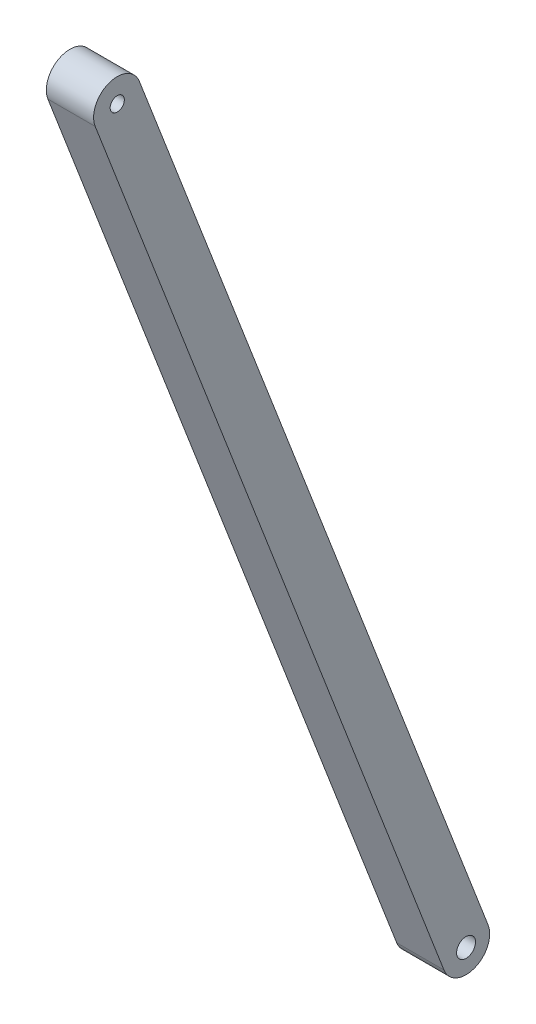
ISO-10303-21;
HEADER;
FILE_DESCRIPTION(('STEP AP214'),'2;1');
FILE_NAME('part.step','',(''),(''),'','','');
FILE_SCHEMA(('AUTOMOTIVE_DESIGN { 1 0 10303 214 1 1 1 1 }'));
ENDSEC;
DATA;
#1=APPLICATION_CONTEXT('core data for automotive mechanical design processes');
#2=APPLICATION_PROTOCOL_DEFINITION('international standard','automotive_design',2000,#1);
#3=PRODUCT_CONTEXT('',#1,'mechanical');
#4=PRODUCT('Part','Part','',(#3));
#5=PRODUCT_RELATED_PRODUCT_CATEGORY('part','',(#4));
#6=PRODUCT_DEFINITION_FORMATION('','',#4);
#7=PRODUCT_DEFINITION_CONTEXT('part definition',#1,'design');
#8=PRODUCT_DEFINITION('design','',#6,#7);
#9=PRODUCT_DEFINITION_SHAPE('','',#8);
#10=(LENGTH_UNIT() NAMED_UNIT(*) SI_UNIT(.MILLI.,.METRE.));
#11=(NAMED_UNIT(*) PLANE_ANGLE_UNIT() SI_UNIT($,.RADIAN.));
#12=(NAMED_UNIT(*) SI_UNIT($,.STERADIAN.) SOLID_ANGLE_UNIT());
#13=UNCERTAINTY_MEASURE_WITH_UNIT(LENGTH_MEASURE(1.E-05),#10,'distance_accuracy_value','');
#14=(GEOMETRIC_REPRESENTATION_CONTEXT(3) GLOBAL_UNCERTAINTY_ASSIGNED_CONTEXT((#13)) GLOBAL_UNIT_ASSIGNED_CONTEXT((#10,
#11,#12)) REPRESENTATION_CONTEXT('',''));
#15=CARTESIAN_POINT('',(0.,0.,0.));
#16=DIRECTION('',(0.,0.,1.));
#17=DIRECTION('',(1.,0.,0.));
#18=AXIS2_PLACEMENT_3D('',#15,#16,#17);
#19=CARTESIAN_POINT('',(-5.,-130.945364679179,33.0464214716655));
#20=DIRECTION('',(1.,0.,0.));
#21=DIRECTION('',(0.,0.,-1.));
#22=AXIS2_PLACEMENT_3D('',#19,#20,#21);
#23=CYLINDRICAL_SURFACE('',#22,5.);
#24=DIRECTION('',(1.,0.,0.));
#25=VECTOR('',#24,1.);
#26=CARTESIAN_POINT('',(-5.,-129.147284523073,28.3809195959594));
#27=LINE('',#26,#25);
#28=CARTESIAN_POINT('',(-5.,-129.147284523073,28.3809195959594));
#29=VERTEX_POINT('',#28);
#30=CARTESIAN_POINT('',(5.,-129.147284523073,28.3809195959594));
#31=VERTEX_POINT('',#30);
#32=EDGE_CURVE('E36',#29,#31,#27,.T.);
#33=ORIENTED_EDGE('',*,*,#32,.T.);
#34=CARTESIAN_POINT('',(5.,-130.945364679179,33.0464214716655));
#35=DIRECTION('',(1.,0.,0.));
#36=DIRECTION('',(0.,0.,-1.));
#37=AXIS2_PLACEMENT_3D('',#34,#35,#36);
#38=CIRCLE('',#37,5.);
#39=CARTESIAN_POINT('',(5.,-132.743444835285,37.7119233473716));
#40=VERTEX_POINT('',#39);
#41=EDGE_CURVE('E73',#40,#31,#38,.T.);
#42=ORIENTED_EDGE('',*,*,#41,.F.);
#43=DIRECTION('',(1.,0.,0.));
#44=VECTOR('',#43,1.);
#45=CARTESIAN_POINT('',(-5.,-132.743444835285,37.7119233473716));
#46=LINE('',#45,#44);
#47=CARTESIAN_POINT('',(-5.,-132.743444835285,37.7119233473716));
#48=VERTEX_POINT('',#47);
#49=EDGE_CURVE('E11',#48,#40,#46,.T.);
#50=ORIENTED_EDGE('',*,*,#49,.F.);
#51=CARTESIAN_POINT('',(-5.,-130.945364679179,33.0464214716655));
#52=DIRECTION('',(1.,0.,0.));
#53=DIRECTION('',(0.,0.,-1.));
#54=AXIS2_PLACEMENT_3D('',#51,#52,#53);
#55=CIRCLE('',#54,5.);
#56=EDGE_CURVE('E74',#48,#29,#55,.T.);
#57=ORIENTED_EDGE('',*,*,#56,.T.);
#58=EDGE_LOOP('',(#33,#42,#50,#57));
#59=FACE_BOUND('',#58,.T.);
#60=ADVANCED_FACE('F33',(#59),#23,.T.);
#61=CARTESIAN_POINT('',(-5.,-132.743444835285,37.7119233473716));
#62=DIRECTION('',(0.,-0.359616031221238,0.93310037514122));
#63=DIRECTION('',(0.,-0.93310037514122,-0.359616031221238));
#64=AXIS2_PLACEMENT_3D('',#61,#62,#63);
#65=PLANE('',#64);
#66=ORIENTED_EDGE('',*,*,#49,.T.);
#67=DIRECTION('',(0.,-0.93310037514122,-0.359616031221238));
#68=VECTOR('',#67,1.);
#69=CARTESIAN_POINT('',(5.,-132.743444835285,37.7119233473716));
#70=LINE('',#69,#68);
#71=CARTESIAN_POINT('',(5.,58.5684572662398,111.443355454795));
#72=VERTEX_POINT('',#71);
#73=EDGE_CURVE('E91',#72,#40,#70,.T.);
#74=ORIENTED_EDGE('',*,*,#73,.F.);
#75=DIRECTION('',(1.,0.,0.));
#76=VECTOR('',#75,1.);
#77=CARTESIAN_POINT('',(-5.,58.5684572662398,111.443355454795));
#78=LINE('',#77,#76);
#79=CARTESIAN_POINT('',(-5.,58.5684572662398,111.443355454795));
#80=VERTEX_POINT('',#79);
#81=EDGE_CURVE('E41',#80,#72,#78,.T.);
#82=ORIENTED_EDGE('',*,*,#81,.F.);
#83=DIRECTION('',(0.,-0.93310037514122,-0.359616031221238));
#84=VECTOR('',#83,1.);
#85=CARTESIAN_POINT('',(-5.,-132.743444835285,37.7119233473716));
#86=LINE('',#85,#84);
#87=EDGE_CURVE('E79',#80,#48,#86,.T.);
#88=ORIENTED_EDGE('',*,*,#87,.T.);
#89=EDGE_LOOP('',(#66,#74,#82,#88));
#90=FACE_BOUND('',#89,.T.);
#91=ADVANCED_FACE('F117',(#90),#65,.T.);
#92=CARTESIAN_POINT('',(-5.,60.3665374223459,106.777853579089));
#93=DIRECTION('',(1.,0.,0.));
#94=DIRECTION('',(0.,0.,-1.));
#95=AXIS2_PLACEMENT_3D('',#92,#93,#94);
#96=CYLINDRICAL_SURFACE('',#95,4.99999999999999);
#97=ORIENTED_EDGE('',*,*,#81,.T.);
#98=CARTESIAN_POINT('',(5.,60.3665374223459,106.777853579089));
#99=DIRECTION('',(1.,0.,0.));
#100=DIRECTION('',(0.,0.,-1.));
#101=AXIS2_PLACEMENT_3D('',#98,#99,#100);
#102=CIRCLE('',#101,4.99999999999999);
#103=CARTESIAN_POINT('',(5.,62.1646175784521,102.112351703383));
#104=VERTEX_POINT('',#103);
#105=EDGE_CURVE('E86',#104,#72,#102,.T.);
#106=ORIENTED_EDGE('',*,*,#105,.F.);
#107=DIRECTION('',(1.,0.,0.));
#108=VECTOR('',#107,1.);
#109=CARTESIAN_POINT('',(-5.,62.1646175784521,102.112351703383));
#110=LINE('',#109,#108);
#111=CARTESIAN_POINT('',(-5.,62.1646175784521,102.112351703383));
#112=VERTEX_POINT('',#111);
#113=EDGE_CURVE('E78',#112,#104,#110,.T.);
#114=ORIENTED_EDGE('',*,*,#113,.F.);
#115=CARTESIAN_POINT('',(-5.,60.3665374223459,106.777853579089));
#116=DIRECTION('',(1.,0.,0.));
#117=DIRECTION('',(0.,0.,-1.));
#118=AXIS2_PLACEMENT_3D('',#115,#116,#117);
#119=CIRCLE('',#118,4.99999999999999);
#120=EDGE_CURVE('E110',#112,#80,#119,.T.);
#121=ORIENTED_EDGE('',*,*,#120,.T.);
#122=EDGE_LOOP('',(#97,#106,#114,#121));
#123=FACE_BOUND('',#122,.T.);
#124=ADVANCED_FACE('F114',(#123),#96,.T.);
#125=CARTESIAN_POINT('',(-5.,-129.147284523073,28.3809195959594));
#126=DIRECTION('',(0.,0.359616031221238,-0.93310037514122));
#127=DIRECTION('',(0.,0.93310037514122,0.359616031221238));
#128=AXIS2_PLACEMENT_3D('',#125,#126,#127);
#129=PLANE('',#128);
#130=ORIENTED_EDGE('',*,*,#113,.T.);
#131=DIRECTION('',(0.,0.93310037514122,0.359616031221238));
#132=VECTOR('',#131,1.);
#133=CARTESIAN_POINT('',(5.,-129.147284523073,28.3809195959594));
#134=LINE('',#133,#132);
#135=EDGE_CURVE('E81',#31,#104,#134,.T.);
#136=ORIENTED_EDGE('',*,*,#135,.F.);
#137=ORIENTED_EDGE('',*,*,#32,.F.);
#138=DIRECTION('',(0.,0.93310037514122,0.359616031221238));
#139=VECTOR('',#138,1.);
#140=CARTESIAN_POINT('',(-5.,-129.147284523073,28.3809195959594));
#141=LINE('',#140,#139);
#142=EDGE_CURVE('E108',#29,#112,#141,.T.);
#143=ORIENTED_EDGE('',*,*,#142,.T.);
#144=EDGE_LOOP('',(#130,#136,#137,#143));
#145=FACE_BOUND('',#144,.T.);
#146=ADVANCED_FACE('F82',(#145),#129,.T.);
#147=CARTESIAN_POINT('',(-5.,-130.945364679179,33.0464214716655));
#148=DIRECTION('',(1.,0.,0.));
#149=DIRECTION('',(0.,0.,-1.));
#150=AXIS2_PLACEMENT_3D('',#147,#148,#149);
#151=PLANE('',#150);
#152=CARTESIAN_POINT('',(-5.,-130.945364679179,33.0464214716655));
#153=DIRECTION('',(1.,0.,0.));
#154=DIRECTION('',(0.,0.,-1.));
#155=AXIS2_PLACEMENT_3D('',#152,#153,#154);
#156=CIRCLE('',#155,2.);
#157=CARTESIAN_POINT('',(-5.,-130.945364679179,31.0464214716655));
#158=VERTEX_POINT('',#157);
#159=EDGE_CURVE('E101',#158,#158,#156,.T.);
#160=ORIENTED_EDGE('',*,*,#159,.T.);
#161=EDGE_LOOP('',(#160));
#162=FACE_BOUND('',#161,.T.);
#163=CARTESIAN_POINT('',(-5.,60.3665374223459,106.777853579089));
#164=DIRECTION('',(1.,0.,0.));
#165=DIRECTION('',(0.,0.,-1.));
#166=AXIS2_PLACEMENT_3D('',#163,#164,#165);
#167=CIRCLE('',#166,1.5);
#168=CARTESIAN_POINT('',(-5.,60.3665374223459,105.277853579089));
#169=VERTEX_POINT('',#168);
#170=EDGE_CURVE('E104',#169,#169,#167,.T.);
#171=ORIENTED_EDGE('',*,*,#170,.T.);
#172=EDGE_LOOP('',(#171));
#173=FACE_BOUND('',#172,.T.);
#174=ORIENTED_EDGE('',*,*,#56,.F.);
#175=ORIENTED_EDGE('',*,*,#87,.F.);
#176=ORIENTED_EDGE('',*,*,#120,.F.);
#177=ORIENTED_EDGE('',*,*,#142,.F.);
#178=EDGE_LOOP('',(#174,#175,#176,#177));
#179=FACE_BOUND('',#178,.T.);
#180=ADVANCED_FACE('F119',(#162,#173,#179),#151,.F.);
#181=CARTESIAN_POINT('',(-5.,60.3665374223459,106.777853579089));
#182=DIRECTION('',(1.,0.,0.));
#183=DIRECTION('',(0.,0.,-1.));
#184=AXIS2_PLACEMENT_3D('',#181,#182,#183);
#185=CYLINDRICAL_SURFACE('',#184,1.5);
#186=ORIENTED_EDGE('',*,*,#170,.F.);
#187=EDGE_LOOP('',(#186));
#188=FACE_BOUND('',#187,.T.);
#189=CARTESIAN_POINT('',(5.,60.3665374223459,106.777853579089));
#190=DIRECTION('',(1.,0.,0.));
#191=DIRECTION('',(0.,0.,-1.));
#192=AXIS2_PLACEMENT_3D('',#189,#190,#191);
#193=CIRCLE('',#192,1.5);
#194=CARTESIAN_POINT('',(5.,60.3665374223459,105.277853579089));
#195=VERTEX_POINT('',#194);
#196=EDGE_CURVE('E92',#195,#195,#193,.T.);
#197=ORIENTED_EDGE('',*,*,#196,.T.);
#198=EDGE_LOOP('',(#197));
#199=FACE_BOUND('',#198,.T.);
#200=ADVANCED_FACE('F121',(#188,#199),#185,.F.);
#201=CARTESIAN_POINT('',(-5.,-130.945364679179,33.0464214716655));
#202=DIRECTION('',(1.,0.,0.));
#203=DIRECTION('',(0.,0.,-1.));
#204=AXIS2_PLACEMENT_3D('',#201,#202,#203);
#205=CYLINDRICAL_SURFACE('',#204,2.);
#206=ORIENTED_EDGE('',*,*,#159,.F.);
#207=EDGE_LOOP('',(#206));
#208=FACE_BOUND('',#207,.T.);
#209=CARTESIAN_POINT('',(5.,-130.945364679179,33.0464214716655));
#210=DIRECTION('',(1.,0.,0.));
#211=DIRECTION('',(0.,0.,-1.));
#212=AXIS2_PLACEMENT_3D('',#209,#210,#211);
#213=CIRCLE('',#212,2.);
#214=CARTESIAN_POINT('',(5.,-130.945364679179,31.0464214716655));
#215=VERTEX_POINT('',#214);
#216=EDGE_CURVE('E95',#215,#215,#213,.T.);
#217=ORIENTED_EDGE('',*,*,#216,.T.);
#218=EDGE_LOOP('',(#217));
#219=FACE_BOUND('',#218,.T.);
#220=ADVANCED_FACE('F128',(#208,#219),#205,.F.);
#221=CARTESIAN_POINT('',(5.,-130.945364679179,33.0464214716655));
#222=DIRECTION('',(1.,0.,0.));
#223=DIRECTION('',(0.,0.,-1.));
#224=AXIS2_PLACEMENT_3D('',#221,#222,#223);
#225=PLANE('',#224);
#226=ORIENTED_EDGE('',*,*,#196,.F.);
#227=EDGE_LOOP('',(#226));
#228=FACE_BOUND('',#227,.T.);
#229=ORIENTED_EDGE('',*,*,#41,.T.);
#230=ORIENTED_EDGE('',*,*,#135,.T.);
#231=ORIENTED_EDGE('',*,*,#105,.T.);
#232=ORIENTED_EDGE('',*,*,#73,.T.);
#233=EDGE_LOOP('',(#229,#230,#231,#232));
#234=FACE_BOUND('',#233,.T.);
#235=ORIENTED_EDGE('',*,*,#216,.F.);
#236=EDGE_LOOP('',(#235));
#237=FACE_BOUND('',#236,.T.);
#238=ADVANCED_FACE('F89',(#228,#234,#237),#225,.T.);
#239=CLOSED_SHELL('',(#60,#91,#124,#146,#180,#200,#220,#238));
#240=MANIFOLD_SOLID_BREP('B2',#239);
#241=ADVANCED_BREP_SHAPE_REPRESENTATION('',(#18,#240),#14);
#242=SHAPE_DEFINITION_REPRESENTATION(#9,#241);
ENDSEC;
END-ISO-10303-21;
